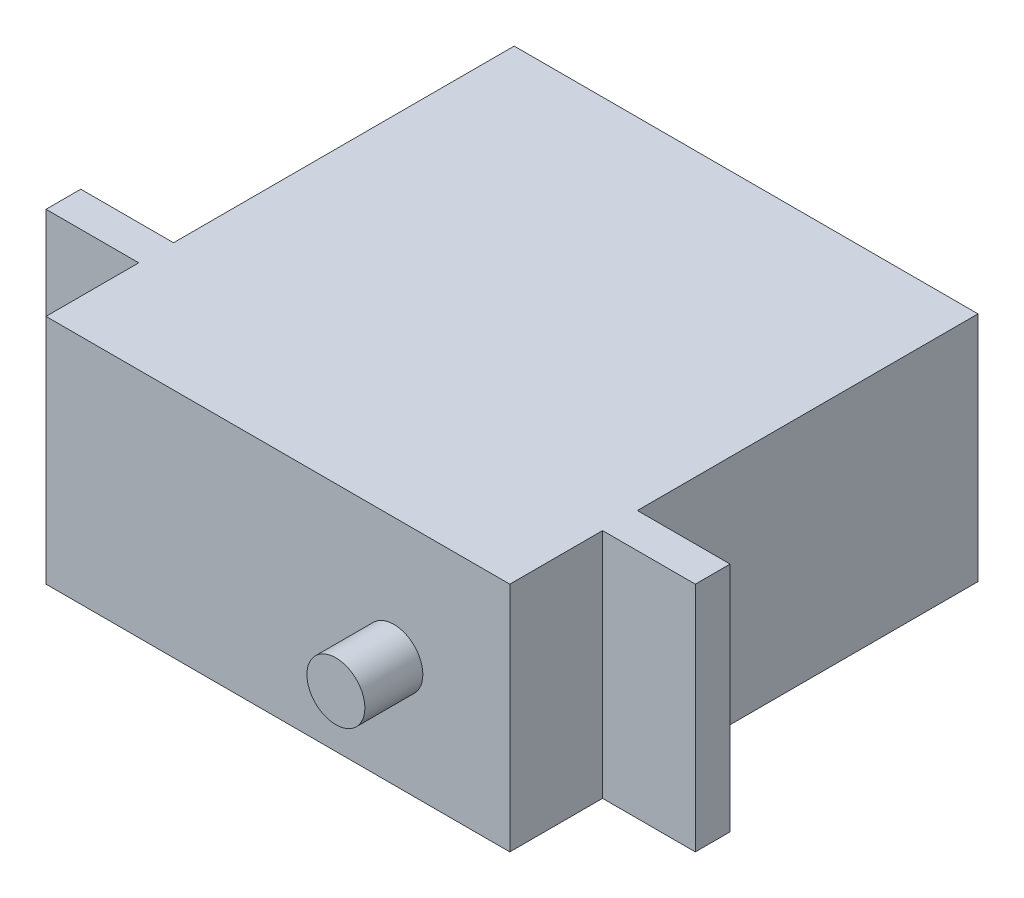
ISO-10303-21;
HEADER;
FILE_DESCRIPTION(('STEP AP214'),'2;1');
FILE_NAME('part.step','',(''),(''),'','','');
FILE_SCHEMA(('AUTOMOTIVE_DESIGN { 1 0 10303 214 1 1 1 1 }'));
ENDSEC;
DATA;
#1=APPLICATION_CONTEXT('core data for automotive mechanical design processes');
#2=APPLICATION_PROTOCOL_DEFINITION('international standard','automotive_design',2000,#1);
#3=PRODUCT_CONTEXT('',#1,'mechanical');
#4=PRODUCT('Part','Part','',(#3));
#5=PRODUCT_RELATED_PRODUCT_CATEGORY('part','',(#4));
#6=PRODUCT_DEFINITION_FORMATION('','',#4);
#7=PRODUCT_DEFINITION_CONTEXT('part definition',#1,'design');
#8=PRODUCT_DEFINITION('design','',#6,#7);
#9=PRODUCT_DEFINITION_SHAPE('','',#8);
#10=(LENGTH_UNIT() NAMED_UNIT(*) SI_UNIT(.MILLI.,.METRE.));
#11=(NAMED_UNIT(*) PLANE_ANGLE_UNIT() SI_UNIT($,.RADIAN.));
#12=(NAMED_UNIT(*) SI_UNIT($,.STERADIAN.) SOLID_ANGLE_UNIT());
#13=UNCERTAINTY_MEASURE_WITH_UNIT(LENGTH_MEASURE(1.E-05),#10,'distance_accuracy_value','');
#14=(GEOMETRIC_REPRESENTATION_CONTEXT(3) GLOBAL_UNCERTAINTY_ASSIGNED_CONTEXT((#13)) GLOBAL_UNIT_ASSIGNED_CONTEXT((#10,
#11,#12)) REPRESENTATION_CONTEXT('',''));
#15=CARTESIAN_POINT('',(0.,0.,0.));
#16=DIRECTION('',(0.,0.,1.));
#17=DIRECTION('',(1.,0.,0.));
#18=AXIS2_PLACEMENT_3D('',#15,#16,#17);
#19=CARTESIAN_POINT('',(-59.9999991059303,120.838045375584,-60.9999989718199));
#20=DIRECTION('',(-1.,0.,0.));
#21=DIRECTION('',(0.,1.,0.));
#22=AXIS2_PLACEMENT_3D('',#19,#20,#21);
#23=PLANE('',#22);
#24=DIRECTION('',(0.,-1.,0.));
#25=VECTOR('',#24,1.);
#26=CARTESIAN_POINT('',(-59.9999991059303,126.088044742284,-60.9999989718199));
#27=LINE('',#26,#25);
#28=CARTESIAN_POINT('',(-59.9999991059303,141.338044108985,-60.9999989718199));
#29=VERTEX_POINT('',#28);
#30=CARTESIAN_POINT('',(-59.9999991059303,121.338044108985,-60.9999989718199));
#31=VERTEX_POINT('',#30);
#32=EDGE_CURVE('E212',#29,#31,#27,.T.);
#33=ORIENTED_EDGE('',*,*,#32,.F.);
#34=DIRECTION('',(0.,0.,-1.));
#35=VECTOR('',#34,1.);
#36=CARTESIAN_POINT('',(-59.9999991059303,141.338044108985,-74.1889989718199));
#37=LINE('',#36,#35);
#38=CARTESIAN_POINT('',(-59.9999991059303,141.338044108985,-90.3779989718199));
#39=VERTEX_POINT('',#38);
#40=EDGE_CURVE('E11',#29,#39,#37,.T.);
#41=ORIENTED_EDGE('',*,*,#40,.T.);
#42=DIRECTION('',(0.,-1.,0.));
#43=VECTOR('',#42,1.);
#44=CARTESIAN_POINT('',(-59.9999991059303,120.838044742284,-90.3779989718199));
#45=LINE('',#44,#43);
#46=CARTESIAN_POINT('',(-59.9999991059303,121.338044108985,-90.3779989718199));
#47=VERTEX_POINT('',#46);
#48=EDGE_CURVE('E197',#39,#47,#45,.T.);
#49=ORIENTED_EDGE('',*,*,#48,.T.);
#50=DIRECTION('',(0.,0.,1.));
#51=VECTOR('',#50,1.);
#52=CARTESIAN_POINT('',(-59.9999991059303,121.338044108985,-60.9999989718199));
#53=LINE('',#52,#51);
#54=EDGE_CURVE('E28',#47,#31,#53,.T.);
#55=ORIENTED_EDGE('',*,*,#54,.T.);
#56=EDGE_LOOP('',(#33,#41,#49,#55));
#57=FACE_BOUND('',#56,.T.);
#58=ADVANCED_FACE('F17',(#57),#23,.T.);
#59=CARTESIAN_POINT('',(-60.3499991059303,141.338044108985,-87.3779989718199));
#60=DIRECTION('',(0.,1.,0.));
#61=DIRECTION('',(0.,0.,-1.));
#62=AXIS2_PLACEMENT_3D('',#59,#60,#61);
#63=PLANE('',#62);
#64=DIRECTION('',(0.,0.,1.));
#65=VECTOR('',#64,1.);
#66=CARTESIAN_POINT('',(-19.9999991059303,141.338044108985,-74.1889989718199));
#67=LINE('',#66,#65);
#68=CARTESIAN_POINT('',(-19.9999991059303,141.338044108985,-90.3779989718199));
#69=VERTEX_POINT('',#68);
#70=CARTESIAN_POINT('',(-19.9999991059303,141.338044108985,-60.9999989718199));
#71=VERTEX_POINT('',#70);
#72=EDGE_CURVE('E194',#69,#71,#67,.T.);
#73=ORIENTED_EDGE('',*,*,#72,.F.);
#74=DIRECTION('',(1.,0.,0.));
#75=VECTOR('',#74,1.);
#76=CARTESIAN_POINT('',(-60.3499991059303,141.338044108985,-90.3779989718199));
#77=LINE('',#76,#75);
#78=EDGE_CURVE('E208',#39,#69,#77,.T.);
#79=ORIENTED_EDGE('',*,*,#78,.F.);
#80=ORIENTED_EDGE('',*,*,#40,.F.);
#81=DIRECTION('',(-1.,0.,0.));
#82=VECTOR('',#81,1.);
#83=CARTESIAN_POINT('',(-31.6749986588955,141.338044108985,-60.9999989718199));
#84=LINE('',#83,#82);
#85=CARTESIAN_POINT('',(-67.9999991059303,141.338044108985,-60.9999989718199));
#86=VERTEX_POINT('',#85);
#87=EDGE_CURVE('E240',#29,#86,#84,.T.);
#88=ORIENTED_EDGE('',*,*,#87,.T.);
#89=DIRECTION('',(0.,0.,-1.));
#90=VECTOR('',#89,1.);
#91=CARTESIAN_POINT('',(-67.9999991059303,141.338044108985,-74.1889989718199));
#92=LINE('',#91,#90);
#93=CARTESIAN_POINT('',(-67.9999991059303,141.338044108985,-57.9999989718199));
#94=VERTEX_POINT('',#93);
#95=EDGE_CURVE('E187',#94,#86,#92,.T.);
#96=ORIENTED_EDGE('',*,*,#95,.F.);
#97=DIRECTION('',(-1.,0.,0.));
#98=VECTOR('',#97,1.);
#99=CARTESIAN_POINT('',(-31.6749986588955,141.338044108985,-57.9999989718199));
#100=LINE('',#99,#98);
#101=CARTESIAN_POINT('',(-59.9999991059303,141.338044108985,-57.9999989718199));
#102=VERTEX_POINT('',#101);
#103=EDGE_CURVE('E157',#102,#94,#100,.T.);
#104=ORIENTED_EDGE('',*,*,#103,.F.);
#105=DIRECTION('',(0.,0.,-1.));
#106=VECTOR('',#105,1.);
#107=CARTESIAN_POINT('',(-59.9999991059303,141.338044108985,-74.1889989718199));
#108=LINE('',#107,#106);
#109=CARTESIAN_POINT('',(-59.9999991059303,141.338044108985,-49.9999989718199));
#110=VERTEX_POINT('',#109);
#111=EDGE_CURVE('E152',#110,#102,#108,.T.);
#112=ORIENTED_EDGE('',*,*,#111,.F.);
#113=DIRECTION('',(1.,0.,0.));
#114=VECTOR('',#113,1.);
#115=CARTESIAN_POINT('',(-60.3499991059303,141.338044108985,-49.9999989718199));
#116=LINE('',#115,#114);
#117=CARTESIAN_POINT('',(-19.9999991059303,141.338044108985,-49.9999989718199));
#118=VERTEX_POINT('',#117);
#119=EDGE_CURVE('E144',#110,#118,#116,.T.);
#120=ORIENTED_EDGE('',*,*,#119,.T.);
#121=DIRECTION('',(0.,0.,1.));
#122=VECTOR('',#121,1.);
#123=CARTESIAN_POINT('',(-19.9999991059303,141.338044108985,-74.1889989718199));
#124=LINE('',#123,#122);
#125=CARTESIAN_POINT('',(-19.9999991059303,141.338044108985,-57.9999989718199));
#126=VERTEX_POINT('',#125);
#127=EDGE_CURVE('E149',#126,#118,#124,.T.);
#128=ORIENTED_EDGE('',*,*,#127,.F.);
#129=DIRECTION('',(-1.,0.,0.));
#130=VECTOR('',#129,1.);
#131=CARTESIAN_POINT('',(-31.6749986588955,141.338044108985,-57.9999989718199));
#132=LINE('',#131,#130);
#133=CARTESIAN_POINT('',(-11.9999991059303,141.338044108985,-57.9999989718199));
#134=VERTEX_POINT('',#133);
#135=EDGE_CURVE('E219',#134,#126,#132,.T.);
#136=ORIENTED_EDGE('',*,*,#135,.F.);
#137=DIRECTION('',(0.,0.,1.));
#138=VECTOR('',#137,1.);
#139=CARTESIAN_POINT('',(-11.9999991059303,141.338044108985,-74.1889989718199));
#140=LINE('',#139,#138);
#141=CARTESIAN_POINT('',(-11.9999991059303,141.338044108985,-60.9999989718199));
#142=VERTEX_POINT('',#141);
#143=EDGE_CURVE('E199',#142,#134,#140,.T.);
#144=ORIENTED_EDGE('',*,*,#143,.F.);
#145=DIRECTION('',(-1.,0.,0.));
#146=VECTOR('',#145,1.);
#147=CARTESIAN_POINT('',(-31.6749986588955,141.338044108985,-60.9999989718199));
#148=LINE('',#147,#146);
#149=EDGE_CURVE('E189',#142,#71,#148,.T.);
#150=ORIENTED_EDGE('',*,*,#149,.T.);
#151=EDGE_LOOP('',(#73,#79,#80,#88,#96,#104,#112,#120,#128,#136,#144,#150));
#152=FACE_BOUND('',#151,.T.);
#153=ADVANCED_FACE('F147',(#152),#63,.T.);
#154=CARTESIAN_POINT('',(-60.3499991059303,121.338044108985,-60.9999989718199));
#155=DIRECTION('',(0.,-1.,0.));
#156=DIRECTION('',(0.,0.,-1.));
#157=AXIS2_PLACEMENT_3D('',#154,#155,#156);
#158=PLANE('',#157);
#159=ORIENTED_EDGE('',*,*,#54,.F.);
#160=DIRECTION('',(1.,0.,0.));
#161=VECTOR('',#160,1.);
#162=CARTESIAN_POINT('',(-60.3499991059303,121.338044108985,-90.3779989718199));
#163=LINE('',#162,#161);
#164=CARTESIAN_POINT('',(-19.9999991059303,121.338044108985,-90.3779989718199));
#165=VERTEX_POINT('',#164);
#166=EDGE_CURVE('E220',#47,#165,#163,.T.);
#167=ORIENTED_EDGE('',*,*,#166,.T.);
#168=DIRECTION('',(0.,0.,-1.));
#169=VECTOR('',#168,1.);
#170=CARTESIAN_POINT('',(-19.9999991059303,121.338044108985,-60.9999989718199));
#171=LINE('',#170,#169);
#172=CARTESIAN_POINT('',(-19.9999991059303,121.338044108985,-60.9999989718199));
#173=VERTEX_POINT('',#172);
#174=EDGE_CURVE('E255',#173,#165,#171,.T.);
#175=ORIENTED_EDGE('',*,*,#174,.F.);
#176=DIRECTION('',(1.,0.,0.));
#177=VECTOR('',#176,1.);
#178=CARTESIAN_POINT('',(-31.6749986588955,121.338044108985,-60.9999989718199));
#179=LINE('',#178,#177);
#180=CARTESIAN_POINT('',(-11.9999991059303,121.338044108985,-60.9999989718199));
#181=VERTEX_POINT('',#180);
#182=EDGE_CURVE('E183',#173,#181,#179,.T.);
#183=ORIENTED_EDGE('',*,*,#182,.T.);
#184=DIRECTION('',(0.,0.,-1.));
#185=VECTOR('',#184,1.);
#186=CARTESIAN_POINT('',(-11.9999991059303,121.338044108985,-60.9999989718199));
#187=LINE('',#186,#185);
#188=CARTESIAN_POINT('',(-11.9999991059303,121.338044108985,-57.9999989718199));
#189=VERTEX_POINT('',#188);
#190=EDGE_CURVE('E204',#189,#181,#187,.T.);
#191=ORIENTED_EDGE('',*,*,#190,.F.);
#192=DIRECTION('',(1.,0.,0.));
#193=VECTOR('',#192,1.);
#194=CARTESIAN_POINT('',(-31.6749986588955,121.338044108985,-57.9999989718199));
#195=LINE('',#194,#193);
#196=CARTESIAN_POINT('',(-19.9999991059303,121.338044108985,-57.9999989718199));
#197=VERTEX_POINT('',#196);
#198=EDGE_CURVE('E203',#197,#189,#195,.T.);
#199=ORIENTED_EDGE('',*,*,#198,.F.);
#200=DIRECTION('',(0.,0.,-1.));
#201=VECTOR('',#200,1.);
#202=CARTESIAN_POINT('',(-19.9999991059303,121.338044108985,-60.9999989718199));
#203=LINE('',#202,#201);
#204=CARTESIAN_POINT('',(-19.9999991059303,121.338044108985,-49.9999989718199));
#205=VERTEX_POINT('',#204);
#206=EDGE_CURVE('E167',#205,#197,#203,.T.);
#207=ORIENTED_EDGE('',*,*,#206,.F.);
#208=DIRECTION('',(1.,0.,0.));
#209=VECTOR('',#208,1.);
#210=CARTESIAN_POINT('',(-60.3499991059303,121.338044108985,-49.9999989718199));
#211=LINE('',#210,#209);
#212=CARTESIAN_POINT('',(-59.9999991059303,121.338044108985,-49.9999989718199));
#213=VERTEX_POINT('',#212);
#214=EDGE_CURVE('E158',#213,#205,#211,.T.);
#215=ORIENTED_EDGE('',*,*,#214,.F.);
#216=DIRECTION('',(0.,0.,1.));
#217=VECTOR('',#216,1.);
#218=CARTESIAN_POINT('',(-59.9999991059303,121.338044108985,-60.9999989718199));
#219=LINE('',#218,#217);
#220=CARTESIAN_POINT('',(-59.9999991059303,121.338044108985,-57.9999989718199));
#221=VERTEX_POINT('',#220);
#222=EDGE_CURVE('E246',#221,#213,#219,.T.);
#223=ORIENTED_EDGE('',*,*,#222,.F.);
#224=DIRECTION('',(1.,0.,0.));
#225=VECTOR('',#224,1.);
#226=CARTESIAN_POINT('',(-31.6749986588955,121.338044108985,-57.9999989718199));
#227=LINE('',#226,#225);
#228=CARTESIAN_POINT('',(-67.9999991059303,121.338044108985,-57.9999989718199));
#229=VERTEX_POINT('',#228);
#230=EDGE_CURVE('E209',#229,#221,#227,.T.);
#231=ORIENTED_EDGE('',*,*,#230,.F.);
#232=DIRECTION('',(0.,0.,1.));
#233=VECTOR('',#232,1.);
#234=CARTESIAN_POINT('',(-67.9999991059303,121.338044108985,-60.9999989718199));
#235=LINE('',#234,#233);
#236=CARTESIAN_POINT('',(-67.9999991059303,121.338044108985,-60.9999989718199));
#237=VERTEX_POINT('',#236);
#238=EDGE_CURVE('E92',#237,#229,#235,.T.);
#239=ORIENTED_EDGE('',*,*,#238,.F.);
#240=DIRECTION('',(1.,0.,0.));
#241=VECTOR('',#240,1.);
#242=CARTESIAN_POINT('',(-31.6749986588955,121.338044108985,-60.9999989718199));
#243=LINE('',#242,#241);
#244=EDGE_CURVE('E258',#237,#31,#243,.T.);
#245=ORIENTED_EDGE('',*,*,#244,.T.);
#246=EDGE_LOOP('',(#159,#167,#175,#183,#191,#199,#207,#215,#223,#231,#239,#245));
#247=FACE_BOUND('',#246,.T.);
#248=ADVANCED_FACE('F325',(#247),#158,.T.);
#249=CARTESIAN_POINT('',(-60.3499991059303,120.838044108985,-90.3779989718199));
#250=DIRECTION('',(0.,0.,-1.));
#251=DIRECTION('',(-1.,0.,0.));
#252=AXIS2_PLACEMENT_3D('',#249,#250,#251);
#253=PLANE('',#252);
#254=ORIENTED_EDGE('',*,*,#48,.F.);
#255=ORIENTED_EDGE('',*,*,#78,.T.);
#256=DIRECTION('',(0.,1.,0.));
#257=VECTOR('',#256,1.);
#258=CARTESIAN_POINT('',(-19.9999991059303,120.838044742284,-90.3779989718199));
#259=LINE('',#258,#257);
#260=EDGE_CURVE('E198',#165,#69,#259,.T.);
#261=ORIENTED_EDGE('',*,*,#260,.F.);
#262=ORIENTED_EDGE('',*,*,#166,.F.);
#263=EDGE_LOOP('',(#254,#255,#261,#262));
#264=FACE_BOUND('',#263,.T.);
#265=ADVANCED_FACE('F351',(#264),#253,.T.);
#266=CARTESIAN_POINT('',(-19.9999991059303,120.838045375584,-60.9999989718199));
#267=DIRECTION('',(1.,0.,0.));
#268=DIRECTION('',(0.,1.,0.));
#269=AXIS2_PLACEMENT_3D('',#266,#267,#268);
#270=PLANE('',#269);
#271=DIRECTION('',(0.,1.,0.));
#272=VECTOR('',#271,1.);
#273=CARTESIAN_POINT('',(-19.9999991059303,126.088044742284,-60.9999989718199));
#274=LINE('',#273,#272);
#275=EDGE_CURVE('E193',#173,#71,#274,.T.);
#276=ORIENTED_EDGE('',*,*,#275,.F.);
#277=ORIENTED_EDGE('',*,*,#174,.T.);
#278=ORIENTED_EDGE('',*,*,#260,.T.);
#279=ORIENTED_EDGE('',*,*,#72,.T.);
#280=EDGE_LOOP('',(#276,#277,#278,#279));
#281=FACE_BOUND('',#280,.T.);
#282=ADVANCED_FACE('F19',(#281),#270,.T.);
#283=CARTESIAN_POINT('',(-2.99999821186064,131.338044108985,-57.9999989718199));
#284=DIRECTION('',(0.,0.,1.));
#285=DIRECTION('',(0.,-1.,0.));
#286=AXIS2_PLACEMENT_3D('',#283,#284,#285);
#287=PLANE('',#286);
#288=DIRECTION('',(0.,-1.,0.));
#289=VECTOR('',#288,1.);
#290=CARTESIAN_POINT('',(-19.9999991059303,126.088044742284,-57.9999989718199));
#291=LINE('',#290,#289);
#292=EDGE_CURVE('E171',#126,#197,#291,.T.);
#293=ORIENTED_EDGE('',*,*,#292,.T.);
#294=ORIENTED_EDGE('',*,*,#198,.T.);
#295=DIRECTION('',(0.,1.,0.));
#296=VECTOR('',#295,1.);
#297=CARTESIAN_POINT('',(-11.9999991059303,126.088044742284,-57.9999989718199));
#298=LINE('',#297,#296);
#299=EDGE_CURVE('E237',#189,#134,#298,.T.);
#300=ORIENTED_EDGE('',*,*,#299,.T.);
#301=ORIENTED_EDGE('',*,*,#135,.T.);
#302=EDGE_LOOP('',(#293,#294,#300,#301));
#303=FACE_BOUND('',#302,.T.);
#304=ADVANCED_FACE('F340',(#303),#287,.T.);
#305=CARTESIAN_POINT('',(-11.9999991059303,120.838045375584,-60.9999989718199));
#306=DIRECTION('',(1.,0.,0.));
#307=DIRECTION('',(0.,1.,0.));
#308=AXIS2_PLACEMENT_3D('',#305,#306,#307);
#309=PLANE('',#308);
#310=ORIENTED_EDGE('',*,*,#299,.F.);
#311=ORIENTED_EDGE('',*,*,#190,.T.);
#312=DIRECTION('',(0.,1.,0.));
#313=VECTOR('',#312,1.);
#314=CARTESIAN_POINT('',(-11.9999991059303,126.088044742284,-60.9999989718199));
#315=LINE('',#314,#313);
#316=EDGE_CURVE('E188',#181,#142,#315,.T.);
#317=ORIENTED_EDGE('',*,*,#316,.T.);
#318=ORIENTED_EDGE('',*,*,#143,.T.);
#319=EDGE_LOOP('',(#310,#311,#317,#318));
#320=FACE_BOUND('',#319,.T.);
#321=ADVANCED_FACE('F342',(#320),#309,.T.);
#322=CARTESIAN_POINT('',(-67.9999991059303,120.838045375584,-60.9999989718199));
#323=DIRECTION('',(-1.,0.,0.));
#324=DIRECTION('',(0.,1.,0.));
#325=AXIS2_PLACEMENT_3D('',#322,#323,#324);
#326=PLANE('',#325);
#327=DIRECTION('',(0.,-1.,0.));
#328=VECTOR('',#327,1.);
#329=CARTESIAN_POINT('',(-67.9999991059303,126.088044742284,-57.9999989718199));
#330=LINE('',#329,#328);
#331=EDGE_CURVE('E213',#94,#229,#330,.T.);
#332=ORIENTED_EDGE('',*,*,#331,.F.);
#333=ORIENTED_EDGE('',*,*,#95,.T.);
#334=DIRECTION('',(0.,-1.,0.));
#335=VECTOR('',#334,1.);
#336=CARTESIAN_POINT('',(-67.9999991059303,126.088044742284,-60.9999989718199));
#337=LINE('',#336,#335);
#338=EDGE_CURVE('E181',#86,#237,#337,.T.);
#339=ORIENTED_EDGE('',*,*,#338,.T.);
#340=ORIENTED_EDGE('',*,*,#238,.T.);
#341=EDGE_LOOP('',(#332,#333,#339,#340));
#342=FACE_BOUND('',#341,.T.);
#343=ADVANCED_FACE('F334',(#342),#326,.T.);
#344=CARTESIAN_POINT('',(-2.99999821186064,131.338044108985,-60.9999989718199));
#345=DIRECTION('',(0.,0.,1.));
#346=DIRECTION('',(0.,-1.,0.));
#347=AXIS2_PLACEMENT_3D('',#344,#345,#346);
#348=PLANE('',#347);
#349=ORIENTED_EDGE('',*,*,#275,.T.);
#350=ORIENTED_EDGE('',*,*,#149,.F.);
#351=ORIENTED_EDGE('',*,*,#316,.F.);
#352=ORIENTED_EDGE('',*,*,#182,.F.);
#353=EDGE_LOOP('',(#349,#350,#351,#352));
#354=FACE_BOUND('',#353,.T.);
#355=ADVANCED_FACE('F332',(#354),#348,.F.);
#356=CARTESIAN_POINT('',(-2.99999821186064,131.338044108985,-60.9999989718199));
#357=DIRECTION('',(0.,0.,1.));
#358=DIRECTION('',(0.,-1.,0.));
#359=AXIS2_PLACEMENT_3D('',#356,#357,#358);
#360=PLANE('',#359);
#361=ORIENTED_EDGE('',*,*,#32,.T.);
#362=ORIENTED_EDGE('',*,*,#244,.F.);
#363=ORIENTED_EDGE('',*,*,#338,.F.);
#364=ORIENTED_EDGE('',*,*,#87,.F.);
#365=EDGE_LOOP('',(#361,#362,#363,#364));
#366=FACE_BOUND('',#365,.T.);
#367=ADVANCED_FACE('F314',(#366),#360,.F.);
#368=CARTESIAN_POINT('',(-2.99999821186064,131.338044108985,-57.9999989718199));
#369=DIRECTION('',(0.,0.,1.));
#370=DIRECTION('',(0.,-1.,0.));
#371=AXIS2_PLACEMENT_3D('',#368,#369,#370);
#372=PLANE('',#371);
#373=DIRECTION('',(0.,1.,0.));
#374=VECTOR('',#373,1.);
#375=CARTESIAN_POINT('',(-59.9999991059303,126.088044742284,-57.9999989718199));
#376=LINE('',#375,#374);
#377=EDGE_CURVE('E21',#221,#102,#376,.T.);
#378=ORIENTED_EDGE('',*,*,#377,.T.);
#379=ORIENTED_EDGE('',*,*,#103,.T.);
#380=ORIENTED_EDGE('',*,*,#331,.T.);
#381=ORIENTED_EDGE('',*,*,#230,.T.);
#382=EDGE_LOOP('',(#378,#379,#380,#381));
#383=FACE_BOUND('',#382,.T.);
#384=ADVANCED_FACE('F305',(#383),#372,.T.);
#385=CARTESIAN_POINT('',(-60.3499991059303,141.338044108985,-49.9999989718199));
#386=DIRECTION('',(0.,0.,1.));
#387=DIRECTION('',(0.,-1.,0.));
#388=AXIS2_PLACEMENT_3D('',#385,#386,#387);
#389=PLANE('',#388);
#390=CARTESIAN_POINT('',(-29.9999991059303,130.838044108985,-49.9999989718199));
#391=DIRECTION('',(0.,0.,-1.));
#392=DIRECTION('',(-1.,0.,0.));
#393=AXIS2_PLACEMENT_3D('',#390,#391,#392);
#394=CIRCLE('',#393,2.5);
#395=CARTESIAN_POINT('',(-27.4999991059303,130.838044108985,-49.9999989718199));
#396=VERTEX_POINT('',#395);
#397=EDGE_CURVE('E234',#396,#396,#394,.T.);
#398=ORIENTED_EDGE('',*,*,#397,.T.);
#399=EDGE_LOOP('',(#398));
#400=FACE_BOUND('',#399,.T.);
#401=DIRECTION('',(0.,1.,0.));
#402=VECTOR('',#401,1.);
#403=CARTESIAN_POINT('',(-59.9999991059303,131.088044742284,-49.9999989718199));
#404=LINE('',#403,#402);
#405=EDGE_CURVE('E216',#213,#110,#404,.T.);
#406=ORIENTED_EDGE('',*,*,#405,.F.);
#407=ORIENTED_EDGE('',*,*,#214,.T.);
#408=DIRECTION('',(0.,-1.,0.));
#409=VECTOR('',#408,1.);
#410=CARTESIAN_POINT('',(-19.9999991059303,131.088044742284,-49.9999989718199));
#411=LINE('',#410,#409);
#412=EDGE_CURVE('E161',#118,#205,#411,.T.);
#413=ORIENTED_EDGE('',*,*,#412,.F.);
#414=ORIENTED_EDGE('',*,*,#119,.F.);
#415=EDGE_LOOP('',(#406,#407,#413,#414));
#416=FACE_BOUND('',#415,.T.);
#417=ADVANCED_FACE('F162',(#400,#416),#389,.T.);
#418=CARTESIAN_POINT('',(-29.9999991059303,130.838044108985,-44.9999989718199));
#419=DIRECTION('',(0.,0.,1.));
#420=DIRECTION('',(0.,-1.,0.));
#421=AXIS2_PLACEMENT_3D('',#418,#419,#420);
#422=PLANE('',#421);
#423=CARTESIAN_POINT('',(-29.9999991059303,130.838044108985,-44.9999989718199));
#424=DIRECTION('',(0.,0.,1.));
#425=DIRECTION('',(-1.,0.,0.));
#426=AXIS2_PLACEMENT_3D('',#423,#424,#425);
#427=CIRCLE('',#426,2.5);
#428=CARTESIAN_POINT('',(-27.4999991059303,130.838044108985,-44.9999989718199));
#429=VERTEX_POINT('',#428);
#430=EDGE_CURVE('E228',#429,#429,#427,.T.);
#431=ORIENTED_EDGE('',*,*,#430,.T.);
#432=EDGE_LOOP('',(#431));
#433=FACE_BOUND('',#432,.T.);
#434=ADVANCED_FACE('F299',(#433),#422,.T.);
#435=CARTESIAN_POINT('',(-29.9999991059303,130.838044108985,-49.9999989718199));
#436=DIRECTION('',(0.,0.,1.));
#437=DIRECTION('',(-1.,0.,0.));
#438=AXIS2_PLACEMENT_3D('',#435,#436,#437);
#439=CYLINDRICAL_SURFACE('',#438,2.5);
#440=ORIENTED_EDGE('',*,*,#430,.F.);
#441=DIRECTION('',(0.,0.,-1.));
#442=VECTOR('',#441,1.);
#443=CARTESIAN_POINT('',(-27.4999991059303,130.838044108985,-49.9999989718199));
#444=LINE('',#443,#442);
#445=EDGE_CURVE('E274',#429,#396,#444,.T.);
#446=ORIENTED_EDGE('',*,*,#445,.T.);
#447=ORIENTED_EDGE('',*,*,#397,.F.);
#448=ORIENTED_EDGE('',*,*,#445,.F.);
#449=EDGE_LOOP('',(#440,#446,#447,#448));
#450=FACE_BOUND('',#449,.T.);
#451=ADVANCED_FACE('F301',(#450),#439,.T.);
#452=CARTESIAN_POINT('',(-19.9999991059303,120.838045375584,-60.9999989718199));
#453=DIRECTION('',(1.,0.,0.));
#454=DIRECTION('',(0.,1.,0.));
#455=AXIS2_PLACEMENT_3D('',#452,#453,#454);
#456=PLANE('',#455);
#457=ORIENTED_EDGE('',*,*,#292,.F.);
#458=ORIENTED_EDGE('',*,*,#127,.T.);
#459=ORIENTED_EDGE('',*,*,#412,.T.);
#460=ORIENTED_EDGE('',*,*,#206,.T.);
#461=EDGE_LOOP('',(#457,#458,#459,#460));
#462=FACE_BOUND('',#461,.T.);
#463=ADVANCED_FACE('F169',(#462),#456,.T.);
#464=CARTESIAN_POINT('',(-59.9999991059303,120.838045375584,-60.9999989718199));
#465=DIRECTION('',(-1.,0.,0.));
#466=DIRECTION('',(0.,1.,0.));
#467=AXIS2_PLACEMENT_3D('',#464,#465,#466);
#468=PLANE('',#467);
#469=ORIENTED_EDGE('',*,*,#377,.F.);
#470=ORIENTED_EDGE('',*,*,#222,.T.);
#471=ORIENTED_EDGE('',*,*,#405,.T.);
#472=ORIENTED_EDGE('',*,*,#111,.T.);
#473=EDGE_LOOP('',(#469,#470,#471,#472));
#474=FACE_BOUND('',#473,.T.);
#475=ADVANCED_FACE('F337',(#474),#468,.T.);
#476=CLOSED_SHELL('',(#58,#153,#248,#265,#282,#304,#321,#343,#355,#367,#384,#417,#434,#451,#463,#475));
#477=MANIFOLD_SOLID_BREP('B1',#476);
#478=ADVANCED_BREP_SHAPE_REPRESENTATION('',(#18,#477),#14);
#479=SHAPE_DEFINITION_REPRESENTATION(#9,#478);
ENDSEC;
END-ISO-10303-21;
